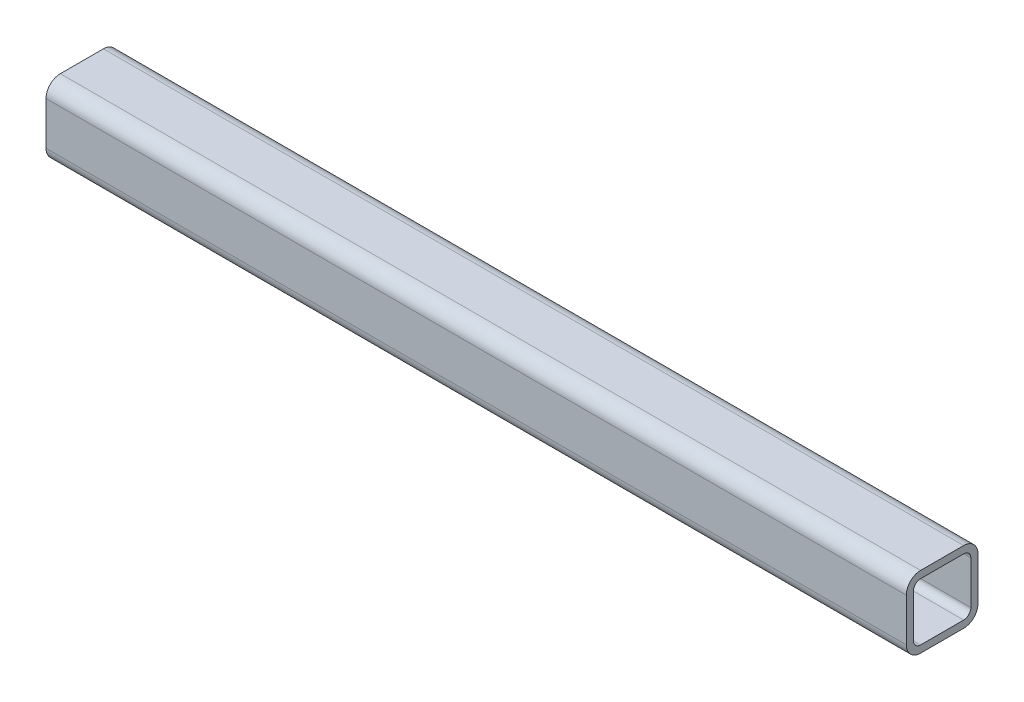
ISO-10303-21;
HEADER;
FILE_DESCRIPTION(('STEP AP214'),'2;1');
FILE_NAME('part.step','',(''),(''),'','','');
FILE_SCHEMA(('AUTOMOTIVE_DESIGN { 1 0 10303 214 1 1 1 1 }'));
ENDSEC;
DATA;
#1=APPLICATION_CONTEXT('core data for automotive mechanical design processes');
#2=APPLICATION_PROTOCOL_DEFINITION('international standard','automotive_design',2000,#1);
#3=PRODUCT_CONTEXT('',#1,'mechanical');
#4=PRODUCT('Part','Part','',(#3));
#5=PRODUCT_RELATED_PRODUCT_CATEGORY('part','',(#4));
#6=PRODUCT_DEFINITION_FORMATION('','',#4);
#7=PRODUCT_DEFINITION_CONTEXT('part definition',#1,'design');
#8=PRODUCT_DEFINITION('design','',#6,#7);
#9=PRODUCT_DEFINITION_SHAPE('','',#8);
#10=(LENGTH_UNIT() NAMED_UNIT(*) SI_UNIT(.MILLI.,.METRE.));
#11=(NAMED_UNIT(*) PLANE_ANGLE_UNIT() SI_UNIT($,.RADIAN.));
#12=(NAMED_UNIT(*) SI_UNIT($,.STERADIAN.) SOLID_ANGLE_UNIT());
#13=UNCERTAINTY_MEASURE_WITH_UNIT(LENGTH_MEASURE(1.E-05),#10,'distance_accuracy_value','');
#14=(GEOMETRIC_REPRESENTATION_CONTEXT(3) GLOBAL_UNCERTAINTY_ASSIGNED_CONTEXT((#13)) GLOBAL_UNIT_ASSIGNED_CONTEXT((#10,
#11,#12)) REPRESENTATION_CONTEXT('',''));
#15=CARTESIAN_POINT('',(0.,0.,0.));
#16=DIRECTION('',(0.,0.,1.));
#17=DIRECTION('',(1.,0.,0.));
#18=AXIS2_PLACEMENT_3D('',#15,#16,#17);
#19=CARTESIAN_POINT('',(600.,15.,15.));
#20=DIRECTION('',(-1.,0.,0.));
#21=DIRECTION('',(0.,0.,1.));
#22=AXIS2_PLACEMENT_3D('',#19,#20,#21);
#23=CYLINDRICAL_SURFACE('',#22,10.);
#24=CARTESIAN_POINT('',(0.,15.,15.));
#25=DIRECTION('',(1.,0.,0.));
#26=DIRECTION('',(0.,0.,-1.));
#27=AXIS2_PLACEMENT_3D('',#24,#25,#26);
#28=CIRCLE('',#27,10.);
#29=CARTESIAN_POINT('',(0.,25.,15.));
#30=VERTEX_POINT('',#29);
#31=CARTESIAN_POINT('',(0.,15.,25.));
#32=VERTEX_POINT('',#31);
#33=EDGE_CURVE('E252',#30,#32,#28,.T.);
#34=ORIENTED_EDGE('',*,*,#33,.T.);
#35=DIRECTION('',(-1.,0.,0.));
#36=VECTOR('',#35,1.);
#37=CARTESIAN_POINT('',(600.,15.,25.));
#38=LINE('',#37,#36);
#39=CARTESIAN_POINT('',(600.,15.,25.));
#40=VERTEX_POINT('',#39);
#41=EDGE_CURVE('E12',#40,#32,#38,.T.);
#42=ORIENTED_EDGE('',*,*,#41,.F.);
#43=CARTESIAN_POINT('',(600.,15.,15.));
#44=DIRECTION('',(1.,0.,0.));
#45=DIRECTION('',(0.,0.,-1.));
#46=AXIS2_PLACEMENT_3D('',#43,#44,#45);
#47=CIRCLE('',#46,10.);
#48=CARTESIAN_POINT('',(600.,25.,15.));
#49=VERTEX_POINT('',#48);
#50=EDGE_CURVE('E358',#49,#40,#47,.T.);
#51=ORIENTED_EDGE('',*,*,#50,.F.);
#52=DIRECTION('',(-1.,0.,0.));
#53=VECTOR('',#52,1.);
#54=CARTESIAN_POINT('',(600.,25.,15.));
#55=LINE('',#54,#53);
#56=EDGE_CURVE('E275',#49,#30,#55,.T.);
#57=ORIENTED_EDGE('',*,*,#56,.T.);
#58=EDGE_LOOP('',(#34,#42,#51,#57));
#59=FACE_BOUND('',#58,.T.);
#60=ADVANCED_FACE('F67',(#59),#23,.T.);
#61=CARTESIAN_POINT('',(600.,15.,25.));
#62=DIRECTION('',(0.,0.,-1.));
#63=DIRECTION('',(0.,1.,0.));
#64=AXIS2_PLACEMENT_3D('',#61,#62,#63);
#65=PLANE('',#64);
#66=DIRECTION('',(0.,-1.,0.));
#67=VECTOR('',#66,1.);
#68=CARTESIAN_POINT('',(0.,15.,25.));
#69=LINE('',#68,#67);
#70=CARTESIAN_POINT('',(0.,-15.,25.));
#71=VERTEX_POINT('',#70);
#72=EDGE_CURVE('E256',#32,#71,#69,.T.);
#73=ORIENTED_EDGE('',*,*,#72,.T.);
#74=DIRECTION('',(-1.,0.,0.));
#75=VECTOR('',#74,1.);
#76=CARTESIAN_POINT('',(600.,-15.,25.));
#77=LINE('',#76,#75);
#78=CARTESIAN_POINT('',(600.,-15.,25.));
#79=VERTEX_POINT('',#78);
#80=EDGE_CURVE('E78',#79,#71,#77,.T.);
#81=ORIENTED_EDGE('',*,*,#80,.F.);
#82=DIRECTION('',(0.,-1.,0.));
#83=VECTOR('',#82,1.);
#84=CARTESIAN_POINT('',(600.,15.,25.));
#85=LINE('',#84,#83);
#86=EDGE_CURVE('E361',#40,#79,#85,.T.);
#87=ORIENTED_EDGE('',*,*,#86,.F.);
#88=ORIENTED_EDGE('',*,*,#41,.T.);
#89=EDGE_LOOP('',(#73,#81,#87,#88));
#90=FACE_BOUND('',#89,.T.);
#91=ADVANCED_FACE('F400',(#90),#65,.F.);
#92=CARTESIAN_POINT('',(600.,-15.,15.));
#93=DIRECTION('',(-1.,0.,0.));
#94=DIRECTION('',(0.,0.,1.));
#95=AXIS2_PLACEMENT_3D('',#92,#93,#94);
#96=CYLINDRICAL_SURFACE('',#95,10.);
#97=CARTESIAN_POINT('',(0.,-15.,15.));
#98=DIRECTION('',(1.,0.,0.));
#99=DIRECTION('',(0.,0.,-1.));
#100=AXIS2_PLACEMENT_3D('',#97,#98,#99);
#101=CIRCLE('',#100,10.);
#102=CARTESIAN_POINT('',(0.,-25.,15.));
#103=VERTEX_POINT('',#102);
#104=EDGE_CURVE('E259',#71,#103,#101,.T.);
#105=ORIENTED_EDGE('',*,*,#104,.T.);
#106=DIRECTION('',(-1.,0.,0.));
#107=VECTOR('',#106,1.);
#108=CARTESIAN_POINT('',(600.,-25.,15.));
#109=LINE('',#108,#107);
#110=CARTESIAN_POINT('',(600.,-25.,15.));
#111=VERTEX_POINT('',#110);
#112=EDGE_CURVE('E286',#111,#103,#109,.T.);
#113=ORIENTED_EDGE('',*,*,#112,.F.);
#114=CARTESIAN_POINT('',(600.,-15.,15.));
#115=DIRECTION('',(1.,0.,0.));
#116=DIRECTION('',(0.,0.,-1.));
#117=AXIS2_PLACEMENT_3D('',#114,#115,#116);
#118=CIRCLE('',#117,10.);
#119=EDGE_CURVE('E364',#79,#111,#118,.T.);
#120=ORIENTED_EDGE('',*,*,#119,.F.);
#121=ORIENTED_EDGE('',*,*,#80,.T.);
#122=EDGE_LOOP('',(#105,#113,#120,#121));
#123=FACE_BOUND('',#122,.T.);
#124=ADVANCED_FACE('F405',(#123),#96,.T.);
#125=CARTESIAN_POINT('',(600.,-25.,-15.));
#126=DIRECTION('',(0.,1.,0.));
#127=DIRECTION('',(0.,0.,1.));
#128=AXIS2_PLACEMENT_3D('',#125,#126,#127);
#129=PLANE('',#128);
#130=DIRECTION('',(0.,0.,-1.));
#131=VECTOR('',#130,1.);
#132=CARTESIAN_POINT('',(0.,-25.,-15.));
#133=LINE('',#132,#131);
#134=CARTESIAN_POINT('',(0.,-25.,-15.));
#135=VERTEX_POINT('',#134);
#136=EDGE_CURVE('E262',#103,#135,#133,.T.);
#137=ORIENTED_EDGE('',*,*,#136,.T.);
#138=DIRECTION('',(-1.,0.,0.));
#139=VECTOR('',#138,1.);
#140=CARTESIAN_POINT('',(600.,-25.,-15.));
#141=LINE('',#140,#139);
#142=CARTESIAN_POINT('',(600.,-25.,-15.));
#143=VERTEX_POINT('',#142);
#144=EDGE_CURVE('E282',#143,#135,#141,.T.);
#145=ORIENTED_EDGE('',*,*,#144,.F.);
#146=DIRECTION('',(0.,0.,-1.));
#147=VECTOR('',#146,1.);
#148=CARTESIAN_POINT('',(600.,-25.,-15.));
#149=LINE('',#148,#147);
#150=EDGE_CURVE('E367',#111,#143,#149,.T.);
#151=ORIENTED_EDGE('',*,*,#150,.F.);
#152=ORIENTED_EDGE('',*,*,#112,.T.);
#153=EDGE_LOOP('',(#137,#145,#151,#152));
#154=FACE_BOUND('',#153,.T.);
#155=ADVANCED_FACE('F375',(#154),#129,.F.);
#156=CARTESIAN_POINT('',(600.,-15.,-15.));
#157=DIRECTION('',(-1.,0.,0.));
#158=DIRECTION('',(0.,0.,1.));
#159=AXIS2_PLACEMENT_3D('',#156,#157,#158);
#160=CYLINDRICAL_SURFACE('',#159,10.);
#161=CARTESIAN_POINT('',(0.,-15.,-15.));
#162=DIRECTION('',(1.,0.,0.));
#163=DIRECTION('',(0.,0.,-1.));
#164=AXIS2_PLACEMENT_3D('',#161,#162,#163);
#165=CIRCLE('',#164,10.);
#166=CARTESIAN_POINT('',(0.,-15.,-25.));
#167=VERTEX_POINT('',#166);
#168=EDGE_CURVE('E265',#135,#167,#165,.T.);
#169=ORIENTED_EDGE('',*,*,#168,.T.);
#170=DIRECTION('',(-1.,0.,0.));
#171=VECTOR('',#170,1.);
#172=CARTESIAN_POINT('',(600.,-15.,-25.));
#173=LINE('',#172,#171);
#174=CARTESIAN_POINT('',(600.,-15.,-25.));
#175=VERTEX_POINT('',#174);
#176=EDGE_CURVE('E209',#175,#167,#173,.T.);
#177=ORIENTED_EDGE('',*,*,#176,.F.);
#178=CARTESIAN_POINT('',(600.,-15.,-15.));
#179=DIRECTION('',(1.,0.,0.));
#180=DIRECTION('',(0.,0.,-1.));
#181=AXIS2_PLACEMENT_3D('',#178,#179,#180);
#182=CIRCLE('',#181,10.);
#183=EDGE_CURVE('E198',#143,#175,#182,.T.);
#184=ORIENTED_EDGE('',*,*,#183,.F.);
#185=ORIENTED_EDGE('',*,*,#144,.T.);
#186=EDGE_LOOP('',(#169,#177,#184,#185));
#187=FACE_BOUND('',#186,.T.);
#188=ADVANCED_FACE('F379',(#187),#160,.T.);
#189=CARTESIAN_POINT('',(600.,-15.,-25.));
#190=DIRECTION('',(0.,0.,1.));
#191=DIRECTION('',(0.,-1.,0.));
#192=AXIS2_PLACEMENT_3D('',#189,#190,#191);
#193=PLANE('',#192);
#194=DIRECTION('',(0.,1.,0.));
#195=VECTOR('',#194,1.);
#196=CARTESIAN_POINT('',(0.,-15.,-25.));
#197=LINE('',#196,#195);
#198=CARTESIAN_POINT('',(0.,15.,-25.));
#199=VERTEX_POINT('',#198);
#200=EDGE_CURVE('E207',#167,#199,#197,.T.);
#201=ORIENTED_EDGE('',*,*,#200,.T.);
#202=DIRECTION('',(-1.,0.,0.));
#203=VECTOR('',#202,1.);
#204=CARTESIAN_POINT('',(600.,15.,-25.));
#205=LINE('',#204,#203);
#206=CARTESIAN_POINT('',(600.,15.,-25.));
#207=VERTEX_POINT('',#206);
#208=EDGE_CURVE('E204',#207,#199,#205,.T.);
#209=ORIENTED_EDGE('',*,*,#208,.F.);
#210=DIRECTION('',(0.,1.,0.));
#211=VECTOR('',#210,1.);
#212=CARTESIAN_POINT('',(600.,-15.,-25.));
#213=LINE('',#212,#211);
#214=EDGE_CURVE('E192',#175,#207,#213,.T.);
#215=ORIENTED_EDGE('',*,*,#214,.F.);
#216=ORIENTED_EDGE('',*,*,#176,.T.);
#217=EDGE_LOOP('',(#201,#209,#215,#216));
#218=FACE_BOUND('',#217,.T.);
#219=ADVANCED_FACE('F205',(#218),#193,.F.);
#220=CARTESIAN_POINT('',(600.,15.,-15.));
#221=DIRECTION('',(-1.,0.,0.));
#222=DIRECTION('',(0.,0.,1.));
#223=AXIS2_PLACEMENT_3D('',#220,#221,#222);
#224=CYLINDRICAL_SURFACE('',#223,10.);
#225=CARTESIAN_POINT('',(0.,15.,-15.));
#226=DIRECTION('',(1.,0.,0.));
#227=DIRECTION('',(0.,0.,-1.));
#228=AXIS2_PLACEMENT_3D('',#225,#226,#227);
#229=CIRCLE('',#228,10.);
#230=CARTESIAN_POINT('',(0.,25.,-15.));
#231=VERTEX_POINT('',#230);
#232=EDGE_CURVE('E140',#199,#231,#229,.T.);
#233=ORIENTED_EDGE('',*,*,#232,.T.);
#234=DIRECTION('',(-1.,0.,0.));
#235=VECTOR('',#234,1.);
#236=CARTESIAN_POINT('',(600.,25.,-15.));
#237=LINE('',#236,#235);
#238=CARTESIAN_POINT('',(600.,25.,-15.));
#239=VERTEX_POINT('',#238);
#240=EDGE_CURVE('E210',#239,#231,#237,.T.);
#241=ORIENTED_EDGE('',*,*,#240,.F.);
#242=CARTESIAN_POINT('',(600.,15.,-15.));
#243=DIRECTION('',(1.,0.,0.));
#244=DIRECTION('',(0.,0.,-1.));
#245=AXIS2_PLACEMENT_3D('',#242,#243,#244);
#246=CIRCLE('',#245,10.);
#247=EDGE_CURVE('E196',#207,#239,#246,.T.);
#248=ORIENTED_EDGE('',*,*,#247,.F.);
#249=ORIENTED_EDGE('',*,*,#208,.T.);
#250=EDGE_LOOP('',(#233,#241,#248,#249));
#251=FACE_BOUND('',#250,.T.);
#252=ADVANCED_FACE('F212',(#251),#224,.T.);
#253=CARTESIAN_POINT('',(600.,-15.,15.));
#254=DIRECTION('',(-1.,0.,0.));
#255=DIRECTION('',(0.,0.,1.));
#256=AXIS2_PLACEMENT_3D('',#253,#254,#255);
#257=CYLINDRICAL_SURFACE('',#256,5.);
#258=CARTESIAN_POINT('',(0.,-15.,15.));
#259=DIRECTION('',(1.,0.,0.));
#260=DIRECTION('',(0.,0.,-1.));
#261=AXIS2_PLACEMENT_3D('',#258,#259,#260);
#262=CIRCLE('',#261,5.);
#263=CARTESIAN_POINT('',(0.,-15.,20.));
#264=VERTEX_POINT('',#263);
#265=CARTESIAN_POINT('',(0.,-20.,15.));
#266=VERTEX_POINT('',#265);
#267=EDGE_CURVE('E220',#264,#266,#262,.T.);
#268=ORIENTED_EDGE('',*,*,#267,.F.);
#269=DIRECTION('',(-1.,0.,0.));
#270=VECTOR('',#269,1.);
#271=CARTESIAN_POINT('',(600.,-15.,20.));
#272=LINE('',#271,#270);
#273=CARTESIAN_POINT('',(600.,-15.,20.));
#274=VERTEX_POINT('',#273);
#275=EDGE_CURVE('E71',#274,#264,#272,.T.);
#276=ORIENTED_EDGE('',*,*,#275,.F.);
#277=CARTESIAN_POINT('',(600.,-15.,15.));
#278=DIRECTION('',(1.,0.,0.));
#279=DIRECTION('',(0.,0.,-1.));
#280=AXIS2_PLACEMENT_3D('',#277,#278,#279);
#281=CIRCLE('',#280,5.);
#282=CARTESIAN_POINT('',(600.,-20.,15.));
#283=VERTEX_POINT('',#282);
#284=EDGE_CURVE('E274',#274,#283,#281,.T.);
#285=ORIENTED_EDGE('',*,*,#284,.T.);
#286=DIRECTION('',(-1.,0.,0.));
#287=VECTOR('',#286,1.);
#288=CARTESIAN_POINT('',(600.,-20.,15.));
#289=LINE('',#288,#287);
#290=EDGE_CURVE('E216',#283,#266,#289,.T.);
#291=ORIENTED_EDGE('',*,*,#290,.T.);
#292=EDGE_LOOP('',(#268,#276,#285,#291));
#293=FACE_BOUND('',#292,.T.);
#294=ADVANCED_FACE('F69',(#293),#257,.F.);
#295=CARTESIAN_POINT('',(600.,15.,20.));
#296=DIRECTION('',(0.,0.,-1.));
#297=DIRECTION('',(0.,1.,0.));
#298=AXIS2_PLACEMENT_3D('',#295,#296,#297);
#299=PLANE('',#298);
#300=DIRECTION('',(0.,-1.,0.));
#301=VECTOR('',#300,1.);
#302=CARTESIAN_POINT('',(0.,15.,20.));
#303=LINE('',#302,#301);
#304=CARTESIAN_POINT('',(0.,15.,20.));
#305=VERTEX_POINT('',#304);
#306=EDGE_CURVE('E224',#305,#264,#303,.T.);
#307=ORIENTED_EDGE('',*,*,#306,.F.);
#308=DIRECTION('',(-1.,0.,0.));
#309=VECTOR('',#308,1.);
#310=CARTESIAN_POINT('',(600.,15.,20.));
#311=LINE('',#310,#309);
#312=CARTESIAN_POINT('',(600.,15.,20.));
#313=VERTEX_POINT('',#312);
#314=EDGE_CURVE('E309',#313,#305,#311,.T.);
#315=ORIENTED_EDGE('',*,*,#314,.F.);
#316=DIRECTION('',(0.,-1.,0.));
#317=VECTOR('',#316,1.);
#318=CARTESIAN_POINT('',(600.,15.,20.));
#319=LINE('',#318,#317);
#320=EDGE_CURVE('E320',#313,#274,#319,.T.);
#321=ORIENTED_EDGE('',*,*,#320,.T.);
#322=ORIENTED_EDGE('',*,*,#275,.T.);
#323=EDGE_LOOP('',(#307,#315,#321,#322));
#324=FACE_BOUND('',#323,.T.);
#325=ADVANCED_FACE('F318',(#324),#299,.T.);
#326=CARTESIAN_POINT('',(600.,15.,15.));
#327=DIRECTION('',(-1.,0.,0.));
#328=DIRECTION('',(0.,0.,1.));
#329=AXIS2_PLACEMENT_3D('',#326,#327,#328);
#330=CYLINDRICAL_SURFACE('',#329,5.);
#331=CARTESIAN_POINT('',(0.,15.,15.));
#332=DIRECTION('',(1.,0.,0.));
#333=DIRECTION('',(0.,0.,-1.));
#334=AXIS2_PLACEMENT_3D('',#331,#332,#333);
#335=CIRCLE('',#334,5.);
#336=CARTESIAN_POINT('',(0.,20.,15.));
#337=VERTEX_POINT('',#336);
#338=EDGE_CURVE('E228',#337,#305,#335,.T.);
#339=ORIENTED_EDGE('',*,*,#338,.F.);
#340=DIRECTION('',(-1.,0.,0.));
#341=VECTOR('',#340,1.);
#342=CARTESIAN_POINT('',(600.,20.,15.));
#343=LINE('',#342,#341);
#344=CARTESIAN_POINT('',(600.,20.,15.));
#345=VERTEX_POINT('',#344);
#346=EDGE_CURVE('E307',#345,#337,#343,.T.);
#347=ORIENTED_EDGE('',*,*,#346,.F.);
#348=CARTESIAN_POINT('',(600.,15.,15.));
#349=DIRECTION('',(1.,0.,0.));
#350=DIRECTION('',(0.,0.,-1.));
#351=AXIS2_PLACEMENT_3D('',#348,#349,#350);
#352=CIRCLE('',#351,5.);
#353=EDGE_CURVE('E328',#345,#313,#352,.T.);
#354=ORIENTED_EDGE('',*,*,#353,.T.);
#355=ORIENTED_EDGE('',*,*,#314,.T.);
#356=EDGE_LOOP('',(#339,#347,#354,#355));
#357=FACE_BOUND('',#356,.T.);
#358=ADVANCED_FACE('F326',(#357),#330,.F.);
#359=CARTESIAN_POINT('',(600.,20.,15.));
#360=DIRECTION('',(0.,-1.,0.));
#361=DIRECTION('',(0.,0.,-1.));
#362=AXIS2_PLACEMENT_3D('',#359,#360,#361);
#363=PLANE('',#362);
#364=DIRECTION('',(0.,0.,1.));
#365=VECTOR('',#364,1.);
#366=CARTESIAN_POINT('',(0.,20.,15.));
#367=LINE('',#366,#365);
#368=CARTESIAN_POINT('',(0.,20.,-15.));
#369=VERTEX_POINT('',#368);
#370=EDGE_CURVE('E232',#369,#337,#367,.T.);
#371=ORIENTED_EDGE('',*,*,#370,.F.);
#372=DIRECTION('',(-1.,0.,0.));
#373=VECTOR('',#372,1.);
#374=CARTESIAN_POINT('',(600.,20.,-15.));
#375=LINE('',#374,#373);
#376=CARTESIAN_POINT('',(600.,20.,-15.));
#377=VERTEX_POINT('',#376);
#378=EDGE_CURVE('E304',#377,#369,#375,.T.);
#379=ORIENTED_EDGE('',*,*,#378,.F.);
#380=DIRECTION('',(0.,0.,1.));
#381=VECTOR('',#380,1.);
#382=CARTESIAN_POINT('',(600.,20.,15.));
#383=LINE('',#382,#381);
#384=EDGE_CURVE('E334',#377,#345,#383,.T.);
#385=ORIENTED_EDGE('',*,*,#384,.T.);
#386=ORIENTED_EDGE('',*,*,#346,.T.);
#387=EDGE_LOOP('',(#371,#379,#385,#386));
#388=FACE_BOUND('',#387,.T.);
#389=ADVANCED_FACE('F338',(#388),#363,.T.);
#390=CARTESIAN_POINT('',(600.,15.,-15.));
#391=DIRECTION('',(-1.,0.,0.));
#392=DIRECTION('',(0.,0.,1.));
#393=AXIS2_PLACEMENT_3D('',#390,#391,#392);
#394=CYLINDRICAL_SURFACE('',#393,5.);
#395=CARTESIAN_POINT('',(0.,15.,-15.));
#396=DIRECTION('',(1.,0.,0.));
#397=DIRECTION('',(0.,0.,-1.));
#398=AXIS2_PLACEMENT_3D('',#395,#396,#397);
#399=CIRCLE('',#398,5.);
#400=CARTESIAN_POINT('',(0.,15.,-20.));
#401=VERTEX_POINT('',#400);
#402=EDGE_CURVE('E236',#401,#369,#399,.T.);
#403=ORIENTED_EDGE('',*,*,#402,.F.);
#404=DIRECTION('',(-1.,0.,0.));
#405=VECTOR('',#404,1.);
#406=CARTESIAN_POINT('',(600.,15.,-20.));
#407=LINE('',#406,#405);
#408=CARTESIAN_POINT('',(600.,15.,-20.));
#409=VERTEX_POINT('',#408);
#410=EDGE_CURVE('E301',#409,#401,#407,.T.);
#411=ORIENTED_EDGE('',*,*,#410,.F.);
#412=CARTESIAN_POINT('',(600.,15.,-15.));
#413=DIRECTION('',(1.,0.,0.));
#414=DIRECTION('',(0.,0.,-1.));
#415=AXIS2_PLACEMENT_3D('',#412,#413,#414);
#416=CIRCLE('',#415,5.);
#417=EDGE_CURVE('E340',#409,#377,#416,.T.);
#418=ORIENTED_EDGE('',*,*,#417,.T.);
#419=ORIENTED_EDGE('',*,*,#378,.T.);
#420=EDGE_LOOP('',(#403,#411,#418,#419));
#421=FACE_BOUND('',#420,.T.);
#422=ADVANCED_FACE('F416',(#421),#394,.F.);
#423=CARTESIAN_POINT('',(600.,-15.,-20.));
#424=DIRECTION('',(0.,0.,1.));
#425=DIRECTION('',(0.,-1.,0.));
#426=AXIS2_PLACEMENT_3D('',#423,#424,#425);
#427=PLANE('',#426);
#428=DIRECTION('',(0.,1.,0.));
#429=VECTOR('',#428,1.);
#430=CARTESIAN_POINT('',(0.,-15.,-20.));
#431=LINE('',#430,#429);
#432=CARTESIAN_POINT('',(0.,-15.,-20.));
#433=VERTEX_POINT('',#432);
#434=EDGE_CURVE('E240',#433,#401,#431,.T.);
#435=ORIENTED_EDGE('',*,*,#434,.F.);
#436=DIRECTION('',(-1.,0.,0.));
#437=VECTOR('',#436,1.);
#438=CARTESIAN_POINT('',(600.,-15.,-20.));
#439=LINE('',#438,#437);
#440=CARTESIAN_POINT('',(600.,-15.,-20.));
#441=VERTEX_POINT('',#440);
#442=EDGE_CURVE('E298',#441,#433,#439,.T.);
#443=ORIENTED_EDGE('',*,*,#442,.F.);
#444=DIRECTION('',(0.,1.,0.));
#445=VECTOR('',#444,1.);
#446=CARTESIAN_POINT('',(600.,-15.,-20.));
#447=LINE('',#446,#445);
#448=EDGE_CURVE('E343',#441,#409,#447,.T.);
#449=ORIENTED_EDGE('',*,*,#448,.T.);
#450=ORIENTED_EDGE('',*,*,#410,.T.);
#451=EDGE_LOOP('',(#435,#443,#449,#450));
#452=FACE_BOUND('',#451,.T.);
#453=ADVANCED_FACE('F412',(#452),#427,.T.);
#454=CARTESIAN_POINT('',(600.,-15.,-15.));
#455=DIRECTION('',(-1.,0.,0.));
#456=DIRECTION('',(0.,0.,1.));
#457=AXIS2_PLACEMENT_3D('',#454,#455,#456);
#458=CYLINDRICAL_SURFACE('',#457,5.);
#459=CARTESIAN_POINT('',(0.,-15.,-15.));
#460=DIRECTION('',(1.,0.,0.));
#461=DIRECTION('',(0.,0.,-1.));
#462=AXIS2_PLACEMENT_3D('',#459,#460,#461);
#463=CIRCLE('',#462,5.);
#464=CARTESIAN_POINT('',(0.,-20.,-15.));
#465=VERTEX_POINT('',#464);
#466=EDGE_CURVE('E244',#465,#433,#463,.T.);
#467=ORIENTED_EDGE('',*,*,#466,.F.);
#468=DIRECTION('',(-1.,0.,0.));
#469=VECTOR('',#468,1.);
#470=CARTESIAN_POINT('',(600.,-20.,-15.));
#471=LINE('',#470,#469);
#472=CARTESIAN_POINT('',(600.,-20.,-15.));
#473=VERTEX_POINT('',#472);
#474=EDGE_CURVE('E295',#473,#465,#471,.T.);
#475=ORIENTED_EDGE('',*,*,#474,.F.);
#476=CARTESIAN_POINT('',(600.,-15.,-15.));
#477=DIRECTION('',(1.,0.,0.));
#478=DIRECTION('',(0.,0.,-1.));
#479=AXIS2_PLACEMENT_3D('',#476,#477,#478);
#480=CIRCLE('',#479,5.);
#481=EDGE_CURVE('E350',#473,#441,#480,.T.);
#482=ORIENTED_EDGE('',*,*,#481,.T.);
#483=ORIENTED_EDGE('',*,*,#442,.T.);
#484=EDGE_LOOP('',(#467,#475,#482,#483));
#485=FACE_BOUND('',#484,.T.);
#486=ADVANCED_FACE('F394',(#485),#458,.F.);
#487=CARTESIAN_POINT('',(600.,-20.,-15.));
#488=DIRECTION('',(0.,1.,0.));
#489=DIRECTION('',(0.,0.,1.));
#490=AXIS2_PLACEMENT_3D('',#487,#488,#489);
#491=PLANE('',#490);
#492=DIRECTION('',(0.,0.,-1.));
#493=VECTOR('',#492,1.);
#494=CARTESIAN_POINT('',(0.,-20.,-15.));
#495=LINE('',#494,#493);
#496=EDGE_CURVE('E248',#266,#465,#495,.T.);
#497=ORIENTED_EDGE('',*,*,#496,.F.);
#498=ORIENTED_EDGE('',*,*,#290,.F.);
#499=DIRECTION('',(0.,0.,-1.));
#500=VECTOR('',#499,1.);
#501=CARTESIAN_POINT('',(600.,-20.,-15.));
#502=LINE('',#501,#500);
#503=EDGE_CURVE('E354',#283,#473,#502,.T.);
#504=ORIENTED_EDGE('',*,*,#503,.T.);
#505=ORIENTED_EDGE('',*,*,#474,.T.);
#506=EDGE_LOOP('',(#497,#498,#504,#505));
#507=FACE_BOUND('',#506,.T.);
#508=ADVANCED_FACE('F387',(#507),#491,.T.);
#509=CARTESIAN_POINT('',(600.,25.,15.));
#510=DIRECTION('',(0.,-1.,0.));
#511=DIRECTION('',(0.,0.,-1.));
#512=AXIS2_PLACEMENT_3D('',#509,#510,#511);
#513=PLANE('',#512);
#514=DIRECTION('',(0.,0.,1.));
#515=VECTOR('',#514,1.);
#516=CARTESIAN_POINT('',(0.,25.,15.));
#517=LINE('',#516,#515);
#518=EDGE_CURVE('E146',#231,#30,#517,.T.);
#519=ORIENTED_EDGE('',*,*,#518,.T.);
#520=ORIENTED_EDGE('',*,*,#56,.F.);
#521=DIRECTION('',(0.,0.,1.));
#522=VECTOR('',#521,1.);
#523=CARTESIAN_POINT('',(600.,25.,15.));
#524=LINE('',#523,#522);
#525=EDGE_CURVE('E87',#239,#49,#524,.T.);
#526=ORIENTED_EDGE('',*,*,#525,.F.);
#527=ORIENTED_EDGE('',*,*,#240,.T.);
#528=EDGE_LOOP('',(#519,#520,#526,#527));
#529=FACE_BOUND('',#528,.T.);
#530=ADVANCED_FACE('F385',(#529),#513,.F.);
#531=CARTESIAN_POINT('',(600.,15.,15.));
#532=DIRECTION('',(1.,0.,0.));
#533=DIRECTION('',(0.,0.,-1.));
#534=AXIS2_PLACEMENT_3D('',#531,#532,#533);
#535=PLANE('',#534);
#536=ORIENTED_EDGE('',*,*,#284,.F.);
#537=ORIENTED_EDGE('',*,*,#320,.F.);
#538=ORIENTED_EDGE('',*,*,#353,.F.);
#539=ORIENTED_EDGE('',*,*,#384,.F.);
#540=ORIENTED_EDGE('',*,*,#417,.F.);
#541=ORIENTED_EDGE('',*,*,#448,.F.);
#542=ORIENTED_EDGE('',*,*,#481,.F.);
#543=ORIENTED_EDGE('',*,*,#503,.F.);
#544=EDGE_LOOP('',(#536,#537,#538,#539,#540,#541,#542,#543));
#545=FACE_BOUND('',#544,.T.);
#546=ORIENTED_EDGE('',*,*,#50,.T.);
#547=ORIENTED_EDGE('',*,*,#86,.T.);
#548=ORIENTED_EDGE('',*,*,#119,.T.);
#549=ORIENTED_EDGE('',*,*,#150,.T.);
#550=ORIENTED_EDGE('',*,*,#183,.T.);
#551=ORIENTED_EDGE('',*,*,#214,.T.);
#552=ORIENTED_EDGE('',*,*,#247,.T.);
#553=ORIENTED_EDGE('',*,*,#525,.T.);
#554=EDGE_LOOP('',(#546,#547,#548,#549,#550,#551,#552,#553));
#555=FACE_BOUND('',#554,.T.);
#556=ADVANCED_FACE('F194',(#545,#555),#535,.T.);
#557=CARTESIAN_POINT('',(0.,15.,15.));
#558=DIRECTION('',(1.,0.,0.));
#559=DIRECTION('',(0.,0.,-1.));
#560=AXIS2_PLACEMENT_3D('',#557,#558,#559);
#561=PLANE('',#560);
#562=ORIENTED_EDGE('',*,*,#267,.T.);
#563=ORIENTED_EDGE('',*,*,#496,.T.);
#564=ORIENTED_EDGE('',*,*,#466,.T.);
#565=ORIENTED_EDGE('',*,*,#434,.T.);
#566=ORIENTED_EDGE('',*,*,#402,.T.);
#567=ORIENTED_EDGE('',*,*,#370,.T.);
#568=ORIENTED_EDGE('',*,*,#338,.T.);
#569=ORIENTED_EDGE('',*,*,#306,.T.);
#570=EDGE_LOOP('',(#562,#563,#564,#565,#566,#567,#568,#569));
#571=FACE_BOUND('',#570,.T.);
#572=ORIENTED_EDGE('',*,*,#33,.F.);
#573=ORIENTED_EDGE('',*,*,#518,.F.);
#574=ORIENTED_EDGE('',*,*,#232,.F.);
#575=ORIENTED_EDGE('',*,*,#200,.F.);
#576=ORIENTED_EDGE('',*,*,#168,.F.);
#577=ORIENTED_EDGE('',*,*,#136,.F.);
#578=ORIENTED_EDGE('',*,*,#104,.F.);
#579=ORIENTED_EDGE('',*,*,#72,.F.);
#580=EDGE_LOOP('',(#572,#573,#574,#575,#576,#577,#578,#579));
#581=FACE_BOUND('',#580,.T.);
#582=ADVANCED_FACE('F323',(#571,#581),#561,.F.);
#583=CLOSED_SHELL('',(#60,#91,#124,#155,#188,#219,#252,#294,#325,#358,#389,#422,#453,#486,#508,
#530,#556,#582));
#584=MANIFOLD_SOLID_BREP('B2',#583);
#585=ADVANCED_BREP_SHAPE_REPRESENTATION('',(#18,#584),#14);
#586=SHAPE_DEFINITION_REPRESENTATION(#9,#585);
ENDSEC;
END-ISO-10303-21;
